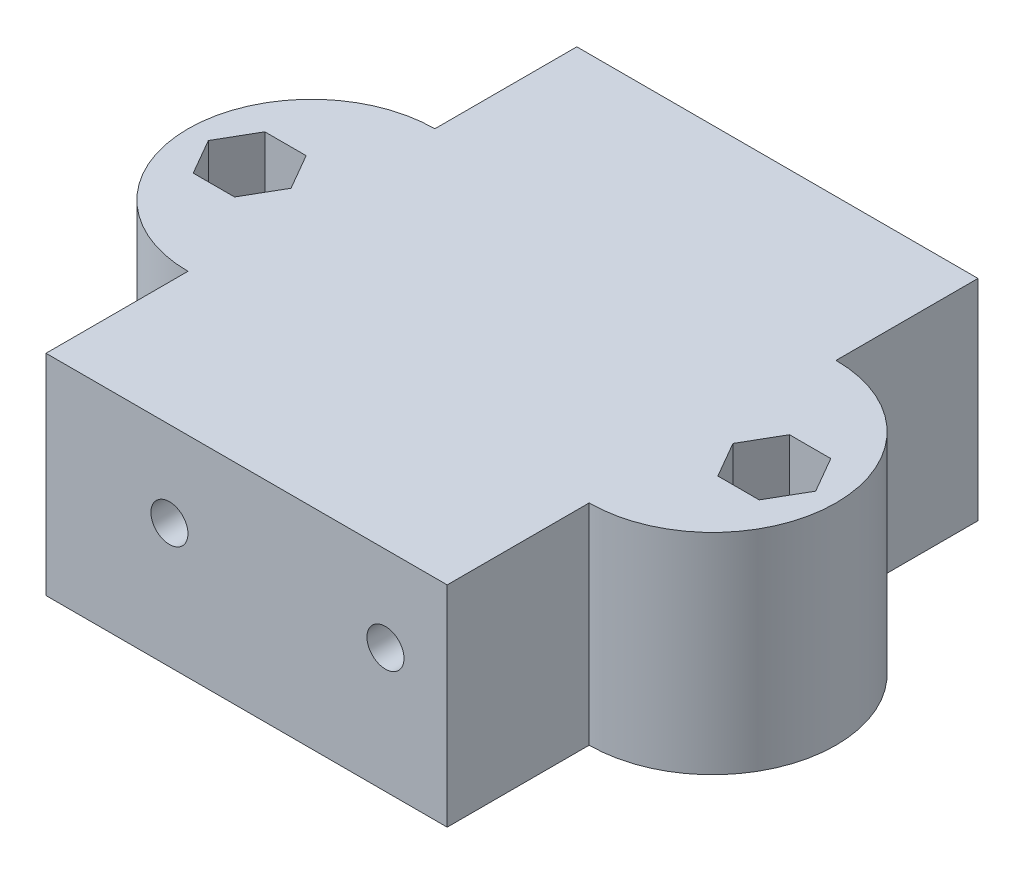
ISO-10303-21;
HEADER;
FILE_DESCRIPTION(('STEP AP214'),'2;1');
FILE_NAME('part.step','',(''),(''),'','','');
FILE_SCHEMA(('AUTOMOTIVE_DESIGN { 1 0 10303 214 1 1 1 1 }'));
ENDSEC;
DATA;
#1=APPLICATION_CONTEXT('core data for automotive mechanical design processes');
#2=APPLICATION_PROTOCOL_DEFINITION('international standard','automotive_design',2000,#1);
#3=PRODUCT_CONTEXT('',#1,'mechanical');
#4=PRODUCT('Part','Part','',(#3));
#5=PRODUCT_RELATED_PRODUCT_CATEGORY('part','',(#4));
#6=PRODUCT_DEFINITION_FORMATION('','',#4);
#7=PRODUCT_DEFINITION_CONTEXT('part definition',#1,'design');
#8=PRODUCT_DEFINITION('design','',#6,#7);
#9=PRODUCT_DEFINITION_SHAPE('','',#8);
#10=(LENGTH_UNIT() NAMED_UNIT(*) SI_UNIT(.MILLI.,.METRE.));
#11=(NAMED_UNIT(*) PLANE_ANGLE_UNIT() SI_UNIT($,.RADIAN.));
#12=(NAMED_UNIT(*) SI_UNIT($,.STERADIAN.) SOLID_ANGLE_UNIT());
#13=UNCERTAINTY_MEASURE_WITH_UNIT(LENGTH_MEASURE(1.E-05),#10,'distance_accuracy_value','');
#14=(GEOMETRIC_REPRESENTATION_CONTEXT(3) GLOBAL_UNCERTAINTY_ASSIGNED_CONTEXT((#13)) GLOBAL_UNIT_ASSIGNED_CONTEXT((#10,
#11,#12)) REPRESENTATION_CONTEXT('',''));
#15=CARTESIAN_POINT('',(0.,0.,0.));
#16=DIRECTION('',(0.,0.,1.));
#17=DIRECTION('',(1.,0.,0.));
#18=AXIS2_PLACEMENT_3D('',#15,#16,#17);
#19=CARTESIAN_POINT('',(21.25,0.,14.6466404826372));
#20=DIRECTION('',(0.,1.,0.));
#21=DIRECTION('',(0.,0.,1.));
#22=AXIS2_PLACEMENT_3D('',#19,#20,#21);
#23=CYLINDRICAL_SURFACE('',#22,1.75);
#24=CARTESIAN_POINT('',(21.25,0.,14.6466404826372));
#25=DIRECTION('',(0.,1.,0.));
#26=DIRECTION('',(0.,0.,1.));
#27=AXIS2_PLACEMENT_3D('',#24,#25,#26);
#28=CIRCLE('',#27,1.75);
#29=CARTESIAN_POINT('',(21.25,0.,16.3966404826372));
#30=VERTEX_POINT('',#29);
#31=EDGE_CURVE('E220',#30,#30,#28,.T.);
#32=ORIENTED_EDGE('',*,*,#31,.F.);
#33=EDGE_LOOP('',(#32));
#34=FACE_BOUND('',#33,.T.);
#35=CARTESIAN_POINT('',(21.25,7.,14.6466404826372));
#36=DIRECTION('',(0.,1.,0.));
#37=DIRECTION('',(0.,0.,1.));
#38=AXIS2_PLACEMENT_3D('',#35,#36,#37);
#39=CIRCLE('',#38,1.75);
#40=CARTESIAN_POINT('',(21.25,7.,16.3966404826372));
#41=VERTEX_POINT('',#40);
#42=EDGE_CURVE('E198',#41,#41,#39,.T.);
#43=ORIENTED_EDGE('',*,*,#42,.T.);
#44=EDGE_LOOP('',(#43));
#45=FACE_BOUND('',#44,.T.);
#46=ADVANCED_FACE('F34',(#34,#45),#23,.F.);
#47=CARTESIAN_POINT('',(0.,0.,0.));
#48=DIRECTION('',(0.,1.,0.));
#49=DIRECTION('',(0.,0.,1.));
#50=AXIS2_PLACEMENT_3D('',#47,#48,#49);
#51=PLANE('',#50);
#52=ORIENTED_EDGE('',*,*,#31,.T.);
#53=EDGE_LOOP('',(#52));
#54=FACE_BOUND('',#53,.T.);
#55=DIRECTION('',(0.,0.,-1.));
#56=VECTOR('',#55,1.);
#57=CARTESIAN_POINT('',(16.25,0.,-6.85335951736274));
#58=LINE('',#57,#56);
#59=CARTESIAN_POINT('',(16.25,0.,36.1466404826372));
#60=VERTEX_POINT('',#59);
#61=CARTESIAN_POINT('',(16.25,0.,24.6466404826372));
#62=VERTEX_POINT('',#61);
#63=EDGE_CURVE('E347',#60,#62,#58,.T.);
#64=ORIENTED_EDGE('',*,*,#63,.F.);
#65=DIRECTION('',(1.,0.,0.));
#66=VECTOR('',#65,1.);
#67=CARTESIAN_POINT('',(-16.25,0.,36.1466404826372));
#68=LINE('',#67,#66);
#69=CARTESIAN_POINT('',(-16.25,0.,36.1466404826372));
#70=VERTEX_POINT('',#69);
#71=EDGE_CURVE('E356',#70,#60,#68,.T.);
#72=ORIENTED_EDGE('',*,*,#71,.F.);
#73=DIRECTION('',(0.,0.,1.));
#74=VECTOR('',#73,1.);
#75=CARTESIAN_POINT('',(-16.25,0.,-6.85335951736274));
#76=LINE('',#75,#74);
#77=CARTESIAN_POINT('',(-16.25,0.,24.6466404826372));
#78=VERTEX_POINT('',#77);
#79=EDGE_CURVE('E352',#78,#70,#76,.T.);
#80=ORIENTED_EDGE('',*,*,#79,.F.);
#81=CARTESIAN_POINT('',(-16.25,0.,14.6466404826372));
#82=DIRECTION('',(0.,1.,0.));
#83=DIRECTION('',(0.,0.,1.));
#84=AXIS2_PLACEMENT_3D('',#81,#82,#83);
#85=CIRCLE('',#84,10.);
#86=CARTESIAN_POINT('',(-16.25,0.,4.64664048263725));
#87=VERTEX_POINT('',#86);
#88=EDGE_CURVE('E283',#78,#87,#85,.F.);
#89=ORIENTED_EDGE('',*,*,#88,.T.);
#90=CARTESIAN_POINT('',(-16.25,0.,-6.85335951736274));
#91=VERTEX_POINT('',#90);
#92=EDGE_CURVE('E353',#91,#87,#76,.T.);
#93=ORIENTED_EDGE('',*,*,#92,.F.);
#94=DIRECTION('',(-1.,0.,0.));
#95=VECTOR('',#94,1.);
#96=CARTESIAN_POINT('',(-16.25,0.,-6.85335951736274));
#97=LINE('',#96,#95);
#98=CARTESIAN_POINT('',(16.25,0.,-6.85335951736274));
#99=VERTEX_POINT('',#98);
#100=EDGE_CURVE('E350',#99,#91,#97,.T.);
#101=ORIENTED_EDGE('',*,*,#100,.F.);
#102=CARTESIAN_POINT('',(16.25,0.,4.64664048263725));
#103=VERTEX_POINT('',#102);
#104=EDGE_CURVE('E346',#103,#99,#58,.T.);
#105=ORIENTED_EDGE('',*,*,#104,.F.);
#106=CARTESIAN_POINT('',(16.25,0.,14.6466404826372));
#107=DIRECTION('',(0.,1.,0.));
#108=DIRECTION('',(0.,0.,1.));
#109=AXIS2_PLACEMENT_3D('',#106,#107,#108);
#110=CIRCLE('',#109,10.);
#111=EDGE_CURVE('E293',#103,#62,#110,.F.);
#112=ORIENTED_EDGE('',*,*,#111,.T.);
#113=EDGE_LOOP('',(#64,#72,#80,#89,#93,#101,#105,#112));
#114=FACE_BOUND('',#113,.T.);
#115=CARTESIAN_POINT('',(0.,0.,14.6466404826372));
#116=DIRECTION('',(0.,1.,0.));
#117=DIRECTION('',(0.,0.,1.));
#118=AXIS2_PLACEMENT_3D('',#115,#116,#117);
#119=CIRCLE('',#118,11.9);
#120=CARTESIAN_POINT('',(0.,0.,26.5466404826372));
#121=VERTEX_POINT('',#120);
#122=EDGE_CURVE('E343',#121,#121,#119,.T.);
#123=ORIENTED_EDGE('',*,*,#122,.T.);
#124=EDGE_LOOP('',(#123));
#125=FACE_BOUND('',#124,.T.);
#126=CARTESIAN_POINT('',(-21.25,0.,14.6466404826373));
#127=DIRECTION('',(0.,1.,0.));
#128=DIRECTION('',(0.,0.,1.));
#129=AXIS2_PLACEMENT_3D('',#126,#127,#128);
#130=CIRCLE('',#129,1.75);
#131=CARTESIAN_POINT('',(-21.25,0.,16.3966404826372));
#132=VERTEX_POINT('',#131);
#133=EDGE_CURVE('E277',#132,#132,#130,.F.);
#134=ORIENTED_EDGE('',*,*,#133,.F.);
#135=EDGE_LOOP('',(#134));
#136=FACE_BOUND('',#135,.T.);
#137=ADVANCED_FACE('F373',(#54,#114,#125,#136),#51,.F.);
#138=CARTESIAN_POINT('',(0.,17.,0.));
#139=DIRECTION('',(0.,1.,0.));
#140=DIRECTION('',(0.,0.,1.));
#141=AXIS2_PLACEMENT_3D('',#138,#139,#140);
#142=PLANE('',#141);
#143=DIRECTION('',(1.,0.,0.));
#144=VECTOR('',#143,1.);
#145=CARTESIAN_POINT('',(19.5756842193501,17.,17.5466404826372));
#146=LINE('',#145,#144);
#147=CARTESIAN_POINT('',(19.5756842193501,17.,17.5466404826372));
#148=VERTEX_POINT('',#147);
#149=CARTESIAN_POINT('',(22.9243157806499,17.,17.5466404826372));
#150=VERTEX_POINT('',#149);
#151=EDGE_CURVE('E49',#148,#150,#146,.T.);
#152=ORIENTED_EDGE('',*,*,#151,.F.);
#153=DIRECTION('',(0.5,0.,0.866025403784439));
#154=VECTOR('',#153,1.);
#155=CARTESIAN_POINT('',(17.9013684387002,17.,14.6466404826372));
#156=LINE('',#155,#154);
#157=CARTESIAN_POINT('',(17.9013684387002,17.,14.6466404826372));
#158=VERTEX_POINT('',#157);
#159=EDGE_CURVE('E192',#158,#148,#156,.T.);
#160=ORIENTED_EDGE('',*,*,#159,.F.);
#161=DIRECTION('',(-0.499999999999999,0.,0.866025403784439));
#162=VECTOR('',#161,1.);
#163=CARTESIAN_POINT('',(19.5756842193501,17.,11.7466404826372));
#164=LINE('',#163,#162);
#165=CARTESIAN_POINT('',(19.5756842193501,17.,11.7466404826372));
#166=VERTEX_POINT('',#165);
#167=EDGE_CURVE('E195',#166,#158,#164,.T.);
#168=ORIENTED_EDGE('',*,*,#167,.F.);
#169=DIRECTION('',(-1.,0.,0.));
#170=VECTOR('',#169,1.);
#171=CARTESIAN_POINT('',(22.9243157806499,17.,11.7466404826372));
#172=LINE('',#171,#170);
#173=CARTESIAN_POINT('',(22.9243157806499,17.,11.7466404826372));
#174=VERTEX_POINT('',#173);
#175=EDGE_CURVE('E213',#174,#166,#172,.T.);
#176=ORIENTED_EDGE('',*,*,#175,.F.);
#177=DIRECTION('',(-0.500000000000001,0.,-0.866025403784438));
#178=VECTOR('',#177,1.);
#179=CARTESIAN_POINT('',(24.5986315612998,17.,14.6466404826372));
#180=LINE('',#179,#178);
#181=CARTESIAN_POINT('',(24.5986315612998,17.,14.6466404826372));
#182=VERTEX_POINT('',#181);
#183=EDGE_CURVE('E210',#182,#174,#180,.T.);
#184=ORIENTED_EDGE('',*,*,#183,.F.);
#185=DIRECTION('',(0.5,0.,-0.866025403784438));
#186=VECTOR('',#185,1.);
#187=CARTESIAN_POINT('',(22.9243157806499,17.,17.5466404826372));
#188=LINE('',#187,#186);
#189=EDGE_CURVE('E208',#150,#182,#188,.T.);
#190=ORIENTED_EDGE('',*,*,#189,.F.);
#191=EDGE_LOOP('',(#152,#160,#168,#176,#184,#190));
#192=FACE_BOUND('',#191,.T.);
#193=DIRECTION('',(0.5,0.,-0.866025403784439));
#194=VECTOR('',#193,1.);
#195=CARTESIAN_POINT('',(-17.9013684387002,17.,14.6466404826373));
#196=LINE('',#195,#194);
#197=CARTESIAN_POINT('',(-19.5756842193501,17.,17.5466404826372));
#198=VERTEX_POINT('',#197);
#199=CARTESIAN_POINT('',(-17.9013684387002,17.,14.6466404826373));
#200=VERTEX_POINT('',#199);
#201=EDGE_CURVE('E57',#198,#200,#196,.T.);
#202=ORIENTED_EDGE('',*,*,#201,.F.);
#203=DIRECTION('',(1.,0.,0.));
#204=VECTOR('',#203,1.);
#205=CARTESIAN_POINT('',(-19.5756842193501,17.,17.5466404826372));
#206=LINE('',#205,#204);
#207=CARTESIAN_POINT('',(-22.9243157806499,17.,17.5466404826373));
#208=VERTEX_POINT('',#207);
#209=EDGE_CURVE('E235',#208,#198,#206,.T.);
#210=ORIENTED_EDGE('',*,*,#209,.F.);
#211=DIRECTION('',(0.5,0.,0.866025403784439));
#212=VECTOR('',#211,1.);
#213=CARTESIAN_POINT('',(-22.9243157806499,17.,17.5466404826373));
#214=LINE('',#213,#212);
#215=CARTESIAN_POINT('',(-24.5986315612998,17.,14.6466404826373));
#216=VERTEX_POINT('',#215);
#217=EDGE_CURVE('E261',#216,#208,#214,.T.);
#218=ORIENTED_EDGE('',*,*,#217,.F.);
#219=DIRECTION('',(-0.500000000000001,0.,0.866025403784438));
#220=VECTOR('',#219,1.);
#221=CARTESIAN_POINT('',(-24.5986315612998,17.,14.6466404826373));
#222=LINE('',#221,#220);
#223=CARTESIAN_POINT('',(-22.9243157806499,17.,11.7466404826373));
#224=VERTEX_POINT('',#223);
#225=EDGE_CURVE('E258',#224,#216,#222,.T.);
#226=ORIENTED_EDGE('',*,*,#225,.F.);
#227=DIRECTION('',(-1.,0.,0.));
#228=VECTOR('',#227,1.);
#229=CARTESIAN_POINT('',(-22.9243157806499,17.,11.7466404826373));
#230=LINE('',#229,#228);
#231=CARTESIAN_POINT('',(-19.5756842193501,17.,11.7466404826373));
#232=VERTEX_POINT('',#231);
#233=EDGE_CURVE('E255',#232,#224,#230,.T.);
#234=ORIENTED_EDGE('',*,*,#233,.F.);
#235=DIRECTION('',(-0.499999999999999,0.,-0.866025403784439));
#236=VECTOR('',#235,1.);
#237=CARTESIAN_POINT('',(-19.5756842193501,17.,11.7466404826373));
#238=LINE('',#237,#236);
#239=EDGE_CURVE('E252',#200,#232,#238,.T.);
#240=ORIENTED_EDGE('',*,*,#239,.F.);
#241=EDGE_LOOP('',(#202,#210,#218,#226,#234,#240));
#242=FACE_BOUND('',#241,.T.);
#243=DIRECTION('',(0.,0.,-1.));
#244=VECTOR('',#243,1.);
#245=CARTESIAN_POINT('',(16.25,17.,-6.85335951736274));
#246=LINE('',#245,#244);
#247=CARTESIAN_POINT('',(16.25,17.,36.1466404826372));
#248=VERTEX_POINT('',#247);
#249=CARTESIAN_POINT('',(16.25,17.,24.6466404826372));
#250=VERTEX_POINT('',#249);
#251=EDGE_CURVE('E327',#248,#250,#246,.T.);
#252=ORIENTED_EDGE('',*,*,#251,.T.);
#253=CARTESIAN_POINT('',(16.25,17.,14.6466404826372));
#254=DIRECTION('',(0.,1.,0.));
#255=DIRECTION('',(0.,0.,-1.));
#256=AXIS2_PLACEMENT_3D('',#253,#254,#255);
#257=CIRCLE('',#256,10.);
#258=CARTESIAN_POINT('',(16.25,17.,4.64664048263725));
#259=VERTEX_POINT('',#258);
#260=EDGE_CURVE('E285',#250,#259,#257,.T.);
#261=ORIENTED_EDGE('',*,*,#260,.T.);
#262=CARTESIAN_POINT('',(16.25,17.,-6.85335951736274));
#263=VERTEX_POINT('',#262);
#264=EDGE_CURVE('E318',#259,#263,#246,.T.);
#265=ORIENTED_EDGE('',*,*,#264,.T.);
#266=DIRECTION('',(-1.,0.,0.));
#267=VECTOR('',#266,1.);
#268=CARTESIAN_POINT('',(-16.25,17.,-6.85335951736274));
#269=LINE('',#268,#267);
#270=CARTESIAN_POINT('',(-16.25,17.,-6.85335951736274));
#271=VERTEX_POINT('',#270);
#272=EDGE_CURVE('E330',#263,#271,#269,.T.);
#273=ORIENTED_EDGE('',*,*,#272,.T.);
#274=DIRECTION('',(0.,0.,1.));
#275=VECTOR('',#274,1.);
#276=CARTESIAN_POINT('',(-16.25,17.,-6.85335951736274));
#277=LINE('',#276,#275);
#278=CARTESIAN_POINT('',(-16.25,17.,4.64664048263725));
#279=VERTEX_POINT('',#278);
#280=EDGE_CURVE('E334',#271,#279,#277,.T.);
#281=ORIENTED_EDGE('',*,*,#280,.T.);
#282=CARTESIAN_POINT('',(-16.25,17.,14.6466404826372));
#283=DIRECTION('',(0.,1.,0.));
#284=DIRECTION('',(0.,0.,1.));
#285=AXIS2_PLACEMENT_3D('',#282,#283,#284);
#286=CIRCLE('',#285,10.);
#287=CARTESIAN_POINT('',(-16.25,17.,24.6466404826372));
#288=VERTEX_POINT('',#287);
#289=EDGE_CURVE('E280',#279,#288,#286,.T.);
#290=ORIENTED_EDGE('',*,*,#289,.T.);
#291=CARTESIAN_POINT('',(-16.25,17.,36.1466404826372));
#292=VERTEX_POINT('',#291);
#293=EDGE_CURVE('E333',#288,#292,#277,.T.);
#294=ORIENTED_EDGE('',*,*,#293,.T.);
#295=DIRECTION('',(1.,0.,0.));
#296=VECTOR('',#295,1.);
#297=CARTESIAN_POINT('',(-16.25,17.,36.1466404826372));
#298=LINE('',#297,#296);
#299=EDGE_CURVE('E337',#292,#248,#298,.T.);
#300=ORIENTED_EDGE('',*,*,#299,.T.);
#301=EDGE_LOOP('',(#252,#261,#265,#273,#281,#290,#294,#300));
#302=FACE_BOUND('',#301,.T.);
#303=ADVANCED_FACE('F383',(#192,#242,#302),#142,.T.);
#304=CARTESIAN_POINT('',(-16.25,12.,-6.85335951736274));
#305=DIRECTION('',(1.,0.,0.));
#306=DIRECTION('',(0.,0.,-1.));
#307=AXIS2_PLACEMENT_3D('',#304,#305,#306);
#308=PLANE('',#307);
#309=ORIENTED_EDGE('',*,*,#92,.T.);
#310=DIRECTION('',(0.,1.,0.));
#311=VECTOR('',#310,1.);
#312=CARTESIAN_POINT('',(-16.25,-22.3606797749979,4.64664048263725));
#313=LINE('',#312,#311);
#314=EDGE_CURVE('E286',#87,#279,#313,.T.);
#315=ORIENTED_EDGE('',*,*,#314,.T.);
#316=ORIENTED_EDGE('',*,*,#280,.F.);
#317=DIRECTION('',(0.,-1.,0.));
#318=VECTOR('',#317,1.);
#319=CARTESIAN_POINT('',(-16.25,12.,-6.85335951736274));
#320=LINE('',#319,#318);
#321=EDGE_CURVE('E42',#271,#91,#320,.T.);
#322=ORIENTED_EDGE('',*,*,#321,.T.);
#323=EDGE_LOOP('',(#309,#315,#316,#322));
#324=FACE_BOUND('',#323,.T.);
#325=ADVANCED_FACE('F367',(#324),#308,.F.);
#326=CARTESIAN_POINT('',(16.25,12.,-6.85335951736274));
#327=DIRECTION('',(-1.,0.,0.));
#328=DIRECTION('',(0.,0.,1.));
#329=AXIS2_PLACEMENT_3D('',#326,#327,#328);
#330=PLANE('',#329);
#331=ORIENTED_EDGE('',*,*,#63,.T.);
#332=DIRECTION('',(0.,1.,0.));
#333=VECTOR('',#332,1.);
#334=CARTESIAN_POINT('',(16.25,-22.3606797749979,24.6466404826372));
#335=LINE('',#334,#333);
#336=EDGE_CURVE('E296',#62,#250,#335,.T.);
#337=ORIENTED_EDGE('',*,*,#336,.T.);
#338=ORIENTED_EDGE('',*,*,#251,.F.);
#339=DIRECTION('',(0.,-1.,0.));
#340=VECTOR('',#339,1.);
#341=CARTESIAN_POINT('',(16.25,12.,36.1466404826372));
#342=LINE('',#341,#340);
#343=EDGE_CURVE('E358',#248,#60,#342,.T.);
#344=ORIENTED_EDGE('',*,*,#343,.T.);
#345=EDGE_LOOP('',(#331,#337,#338,#344));
#346=FACE_BOUND('',#345,.T.);
#347=ADVANCED_FACE('F394',(#346),#330,.F.);
#348=ORIENTED_EDGE('',*,*,#264,.F.);
#349=DIRECTION('',(0.,1.,0.));
#350=VECTOR('',#349,1.);
#351=CARTESIAN_POINT('',(16.25,-22.3606797749979,4.64664048263725));
#352=LINE('',#351,#350);
#353=EDGE_CURVE('E298',#103,#259,#352,.T.);
#354=ORIENTED_EDGE('',*,*,#353,.F.);
#355=ORIENTED_EDGE('',*,*,#104,.T.);
#356=DIRECTION('',(0.,-1.,0.));
#357=VECTOR('',#356,1.);
#358=CARTESIAN_POINT('',(16.25,12.,-6.85335951736274));
#359=LINE('',#358,#357);
#360=EDGE_CURVE('E11',#263,#99,#359,.T.);
#361=ORIENTED_EDGE('',*,*,#360,.F.);
#362=EDGE_LOOP('',(#348,#354,#355,#361));
#363=FACE_BOUND('',#362,.T.);
#364=ADVANCED_FACE('F36',(#363),#330,.F.);
#365=CARTESIAN_POINT('',(-16.25,12.,-6.85335951736274));
#366=DIRECTION('',(0.,0.,1.));
#367=DIRECTION('',(1.,0.,0.));
#368=AXIS2_PLACEMENT_3D('',#365,#366,#367);
#369=PLANE('',#368);
#370=CARTESIAN_POINT('',(11.2500000000001,10.0868549164128,-6.85335951736274));
#371=DIRECTION('',(0.,0.,1.));
#372=DIRECTION('',(1.,0.,0.));
#373=AXIS2_PLACEMENT_3D('',#370,#371,#372);
#374=CIRCLE('',#373,1.5);
#375=CARTESIAN_POINT('',(12.7500000000001,10.0868549164128,-6.85335951736274));
#376=VERTEX_POINT('',#375);
#377=EDGE_CURVE('E307',#376,#376,#374,.T.);
#378=ORIENTED_EDGE('',*,*,#377,.T.);
#379=EDGE_LOOP('',(#378));
#380=FACE_BOUND('',#379,.T.);
#381=CARTESIAN_POINT('',(-6.24999999999995,10.0868549164128,-6.85335951736274));
#382=DIRECTION('',(0.,0.,1.));
#383=DIRECTION('',(1.,0.,0.));
#384=AXIS2_PLACEMENT_3D('',#381,#382,#383);
#385=CIRCLE('',#384,1.5);
#386=CARTESIAN_POINT('',(-4.74999999999995,10.0868549164128,-6.85335951736274));
#387=VERTEX_POINT('',#386);
#388=EDGE_CURVE('E295',#387,#387,#385,.T.);
#389=ORIENTED_EDGE('',*,*,#388,.T.);
#390=EDGE_LOOP('',(#389));
#391=FACE_BOUND('',#390,.T.);
#392=ORIENTED_EDGE('',*,*,#100,.T.);
#393=ORIENTED_EDGE('',*,*,#321,.F.);
#394=ORIENTED_EDGE('',*,*,#272,.F.);
#395=ORIENTED_EDGE('',*,*,#360,.T.);
#396=EDGE_LOOP('',(#392,#393,#394,#395));
#397=FACE_BOUND('',#396,.T.);
#398=ADVANCED_FACE('F386',(#380,#391,#397),#369,.F.);
#399=ORIENTED_EDGE('',*,*,#293,.F.);
#400=DIRECTION('',(0.,1.,0.));
#401=VECTOR('',#400,1.);
#402=CARTESIAN_POINT('',(-16.25,-22.3606797749979,24.6466404826372));
#403=LINE('',#402,#401);
#404=EDGE_CURVE('E288',#78,#288,#403,.T.);
#405=ORIENTED_EDGE('',*,*,#404,.F.);
#406=ORIENTED_EDGE('',*,*,#79,.T.);
#407=DIRECTION('',(0.,-1.,0.));
#408=VECTOR('',#407,1.);
#409=CARTESIAN_POINT('',(-16.25,12.,36.1466404826372));
#410=LINE('',#409,#408);
#411=EDGE_CURVE('E361',#292,#70,#410,.T.);
#412=ORIENTED_EDGE('',*,*,#411,.F.);
#413=EDGE_LOOP('',(#399,#405,#406,#412));
#414=FACE_BOUND('',#413,.T.);
#415=ADVANCED_FACE('F401',(#414),#308,.F.);
#416=CARTESIAN_POINT('',(-16.25,12.,36.1466404826372));
#417=DIRECTION('',(0.,0.,-1.));
#418=DIRECTION('',(-1.,0.,0.));
#419=AXIS2_PLACEMENT_3D('',#416,#417,#418);
#420=PLANE('',#419);
#421=CARTESIAN_POINT('',(11.2500000000001,10.0868549164128,36.1466404826372));
#422=DIRECTION('',(0.,0.,1.));
#423=DIRECTION('',(1.,0.,0.));
#424=AXIS2_PLACEMENT_3D('',#421,#422,#423);
#425=CIRCLE('',#424,1.5);
#426=CARTESIAN_POINT('',(12.7500000000001,10.0868549164128,36.1466404826372));
#427=VERTEX_POINT('',#426);
#428=EDGE_CURVE('E319',#427,#427,#425,.T.);
#429=ORIENTED_EDGE('',*,*,#428,.F.);
#430=EDGE_LOOP('',(#429));
#431=FACE_BOUND('',#430,.T.);
#432=CARTESIAN_POINT('',(-6.24999999999995,10.0868549164128,36.1466404826372));
#433=DIRECTION('',(0.,0.,1.));
#434=DIRECTION('',(1.,0.,0.));
#435=AXIS2_PLACEMENT_3D('',#432,#433,#434);
#436=CIRCLE('',#435,1.5);
#437=CARTESIAN_POINT('',(-4.74999999999995,10.0868549164128,36.1466404826372));
#438=VERTEX_POINT('',#437);
#439=EDGE_CURVE('E306',#438,#438,#436,.T.);
#440=ORIENTED_EDGE('',*,*,#439,.F.);
#441=EDGE_LOOP('',(#440));
#442=FACE_BOUND('',#441,.T.);
#443=ORIENTED_EDGE('',*,*,#71,.T.);
#444=ORIENTED_EDGE('',*,*,#343,.F.);
#445=ORIENTED_EDGE('',*,*,#299,.F.);
#446=ORIENTED_EDGE('',*,*,#411,.T.);
#447=EDGE_LOOP('',(#443,#444,#445,#446));
#448=FACE_BOUND('',#447,.T.);
#449=ADVANCED_FACE('F397',(#431,#442,#448),#420,.F.);
#450=CARTESIAN_POINT('',(0.,12.,14.6466404826372));
#451=DIRECTION('',(0.,-1.,0.));
#452=DIRECTION('',(0.,0.,-1.));
#453=AXIS2_PLACEMENT_3D('',#450,#451,#452);
#454=CYLINDRICAL_SURFACE('',#453,11.9);
#455=CARTESIAN_POINT('',(0.,12.,14.6466404826372));
#456=DIRECTION('',(0.,1.,0.));
#457=DIRECTION('',(0.,0.,1.));
#458=AXIS2_PLACEMENT_3D('',#455,#456,#457);
#459=CIRCLE('',#458,11.9);
#460=CARTESIAN_POINT('',(0.,12.,26.5466404826372));
#461=VERTEX_POINT('',#460);
#462=EDGE_CURVE('E340',#461,#461,#459,.T.);
#463=ORIENTED_EDGE('',*,*,#462,.T.);
#464=EDGE_LOOP('',(#463));
#465=FACE_BOUND('',#464,.T.);
#466=ORIENTED_EDGE('',*,*,#122,.F.);
#467=EDGE_LOOP('',(#466));
#468=FACE_BOUND('',#467,.T.);
#469=ADVANCED_FACE('F408',(#465,#468),#454,.F.);
#470=CARTESIAN_POINT('',(0.,12.,0.));
#471=DIRECTION('',(0.,1.,0.));
#472=DIRECTION('',(0.,0.,1.));
#473=AXIS2_PLACEMENT_3D('',#470,#471,#472);
#474=PLANE('',#473);
#475=ORIENTED_EDGE('',*,*,#462,.F.);
#476=EDGE_LOOP('',(#475));
#477=FACE_BOUND('',#476,.T.);
#478=ADVANCED_FACE('F462',(#477),#474,.F.);
#479=CARTESIAN_POINT('',(-6.24999999999995,10.0868549164128,26.1466404826372));
#480=DIRECTION('',(0.,0.,1.));
#481=DIRECTION('',(1.,0.,0.));
#482=AXIS2_PLACEMENT_3D('',#479,#480,#481);
#483=CYLINDRICAL_SURFACE('',#482,1.5);
#484=CARTESIAN_POINT('',(-6.24999999999995,10.0868549164128,26.1466404826372));
#485=DIRECTION('',(0.,0.,1.));
#486=DIRECTION('',(1.,0.,0.));
#487=AXIS2_PLACEMENT_3D('',#484,#485,#486);
#488=CIRCLE('',#487,1.5);
#489=CARTESIAN_POINT('',(-4.74999999999995,10.0868549164128,26.1466404826372));
#490=VERTEX_POINT('',#489);
#491=EDGE_CURVE('E322',#490,#490,#488,.T.);
#492=ORIENTED_EDGE('',*,*,#491,.F.);
#493=EDGE_LOOP('',(#492));
#494=FACE_BOUND('',#493,.T.);
#495=ORIENTED_EDGE('',*,*,#439,.T.);
#496=EDGE_LOOP('',(#495));
#497=FACE_BOUND('',#496,.T.);
#498=ADVANCED_FACE('F458',(#494,#497),#483,.F.);
#499=CARTESIAN_POINT('',(-6.24999999999995,10.0868549164128,26.1466404826372));
#500=DIRECTION('',(0.,0.,1.));
#501=DIRECTION('',(1.,0.,0.));
#502=AXIS2_PLACEMENT_3D('',#499,#500,#501);
#503=PLANE('',#502);
#504=ORIENTED_EDGE('',*,*,#491,.T.);
#505=EDGE_LOOP('',(#504));
#506=FACE_BOUND('',#505,.T.);
#507=ADVANCED_FACE('F454',(#506),#503,.T.);
#508=CARTESIAN_POINT('',(11.2500000000001,10.0868549164128,26.1466404826372));
#509=DIRECTION('',(0.,0.,1.));
#510=DIRECTION('',(1.,0.,0.));
#511=AXIS2_PLACEMENT_3D('',#508,#509,#510);
#512=CYLINDRICAL_SURFACE('',#511,1.5);
#513=CARTESIAN_POINT('',(11.2500000000001,10.0868549164128,26.1466404826372));
#514=DIRECTION('',(0.,0.,1.));
#515=DIRECTION('',(1.,0.,0.));
#516=AXIS2_PLACEMENT_3D('',#513,#514,#515);
#517=CIRCLE('',#516,1.5);
#518=CARTESIAN_POINT('',(12.7500000000001,10.0868549164128,26.1466404826372));
#519=VERTEX_POINT('',#518);
#520=EDGE_CURVE('E315',#519,#519,#517,.T.);
#521=ORIENTED_EDGE('',*,*,#520,.F.);
#522=EDGE_LOOP('',(#521));
#523=FACE_BOUND('',#522,.T.);
#524=ORIENTED_EDGE('',*,*,#428,.T.);
#525=EDGE_LOOP('',(#524));
#526=FACE_BOUND('',#525,.T.);
#527=ADVANCED_FACE('F450',(#523,#526),#512,.F.);
#528=CARTESIAN_POINT('',(11.2500000000001,10.0868549164128,26.1466404826372));
#529=DIRECTION('',(0.,0.,1.));
#530=DIRECTION('',(1.,0.,0.));
#531=AXIS2_PLACEMENT_3D('',#528,#529,#530);
#532=PLANE('',#531);
#533=ORIENTED_EDGE('',*,*,#520,.T.);
#534=EDGE_LOOP('',(#533));
#535=FACE_BOUND('',#534,.T.);
#536=ADVANCED_FACE('F446',(#535),#532,.T.);
#537=CARTESIAN_POINT('',(-6.24999999999995,10.0868549164128,3.14664048263726));
#538=DIRECTION('',(0.,0.,-1.));
#539=DIRECTION('',(-1.,0.,0.));
#540=AXIS2_PLACEMENT_3D('',#537,#538,#539);
#541=CYLINDRICAL_SURFACE('',#540,1.5);
#542=CARTESIAN_POINT('',(-6.24999999999995,10.0868549164128,3.14664048263726));
#543=DIRECTION('',(0.,0.,1.));
#544=DIRECTION('',(1.,0.,0.));
#545=AXIS2_PLACEMENT_3D('',#542,#543,#544);
#546=CIRCLE('',#545,1.5);
#547=CARTESIAN_POINT('',(-4.74999999999995,10.0868549164128,3.14664048263726));
#548=VERTEX_POINT('',#547);
#549=EDGE_CURVE('E310',#548,#548,#546,.T.);
#550=ORIENTED_EDGE('',*,*,#549,.T.);
#551=EDGE_LOOP('',(#550));
#552=FACE_BOUND('',#551,.T.);
#553=ORIENTED_EDGE('',*,*,#388,.F.);
#554=EDGE_LOOP('',(#553));
#555=FACE_BOUND('',#554,.T.);
#556=ADVANCED_FACE('F442',(#552,#555),#541,.F.);
#557=CARTESIAN_POINT('',(-6.24999999999995,10.0868549164128,3.14664048263726));
#558=DIRECTION('',(0.,0.,-1.));
#559=DIRECTION('',(1.,0.,0.));
#560=AXIS2_PLACEMENT_3D('',#557,#558,#559);
#561=PLANE('',#560);
#562=ORIENTED_EDGE('',*,*,#549,.F.);
#563=EDGE_LOOP('',(#562));
#564=FACE_BOUND('',#563,.T.);
#565=ADVANCED_FACE('F438',(#564),#561,.T.);
#566=CARTESIAN_POINT('',(11.2500000000001,10.0868549164128,3.14664048263726));
#567=DIRECTION('',(0.,0.,-1.));
#568=DIRECTION('',(-1.,0.,0.));
#569=AXIS2_PLACEMENT_3D('',#566,#567,#568);
#570=CYLINDRICAL_SURFACE('',#569,1.5);
#571=CARTESIAN_POINT('',(11.2500000000001,10.0868549164128,3.14664048263726));
#572=DIRECTION('',(0.,0.,1.));
#573=DIRECTION('',(1.,0.,0.));
#574=AXIS2_PLACEMENT_3D('',#571,#572,#573);
#575=CIRCLE('',#574,1.5);
#576=CARTESIAN_POINT('',(12.7500000000001,10.0868549164128,3.14664048263726));
#577=VERTEX_POINT('',#576);
#578=EDGE_CURVE('E303',#577,#577,#575,.T.);
#579=ORIENTED_EDGE('',*,*,#578,.T.);
#580=EDGE_LOOP('',(#579));
#581=FACE_BOUND('',#580,.T.);
#582=ORIENTED_EDGE('',*,*,#377,.F.);
#583=EDGE_LOOP('',(#582));
#584=FACE_BOUND('',#583,.T.);
#585=ADVANCED_FACE('F434',(#581,#584),#570,.F.);
#586=CARTESIAN_POINT('',(11.2500000000001,10.0868549164128,3.14664048263726));
#587=DIRECTION('',(0.,0.,-1.));
#588=DIRECTION('',(1.,0.,0.));
#589=AXIS2_PLACEMENT_3D('',#586,#587,#588);
#590=PLANE('',#589);
#591=ORIENTED_EDGE('',*,*,#578,.F.);
#592=EDGE_LOOP('',(#591));
#593=FACE_BOUND('',#592,.T.);
#594=ADVANCED_FACE('F431',(#593),#590,.T.);
#595=CARTESIAN_POINT('',(16.25,-22.3606797749979,14.6466404826372));
#596=DIRECTION('',(0.,1.,0.));
#597=DIRECTION('',(0.,0.,1.));
#598=AXIS2_PLACEMENT_3D('',#595,#596,#597);
#599=CYLINDRICAL_SURFACE('',#598,10.);
#600=ORIENTED_EDGE('',*,*,#111,.F.);
#601=ORIENTED_EDGE('',*,*,#353,.T.);
#602=ORIENTED_EDGE('',*,*,#260,.F.);
#603=ORIENTED_EDGE('',*,*,#336,.F.);
#604=EDGE_LOOP('',(#600,#601,#602,#603));
#605=FACE_BOUND('',#604,.T.);
#606=ADVANCED_FACE('F391',(#605),#599,.T.);
#607=CARTESIAN_POINT('',(-16.25,-22.3606797749979,14.6466404826372));
#608=DIRECTION('',(0.,1.,0.));
#609=DIRECTION('',(0.,0.,1.));
#610=AXIS2_PLACEMENT_3D('',#607,#608,#609);
#611=CYLINDRICAL_SURFACE('',#610,10.);
#612=ORIENTED_EDGE('',*,*,#88,.F.);
#613=ORIENTED_EDGE('',*,*,#404,.T.);
#614=ORIENTED_EDGE('',*,*,#289,.F.);
#615=ORIENTED_EDGE('',*,*,#314,.F.);
#616=EDGE_LOOP('',(#612,#613,#614,#615));
#617=FACE_BOUND('',#616,.T.);
#618=ADVANCED_FACE('F381',(#617),#611,.T.);
#619=CARTESIAN_POINT('',(-21.25,0.,14.6466404826373));
#620=DIRECTION('',(0.,1.,0.));
#621=DIRECTION('',(0.,0.,1.));
#622=AXIS2_PLACEMENT_3D('',#619,#620,#621);
#623=CYLINDRICAL_SURFACE('',#622,1.75);
#624=CARTESIAN_POINT('',(-21.25,7.,14.6466404826373));
#625=DIRECTION('',(0.,1.,0.));
#626=DIRECTION('',(0.,0.,-1.));
#627=AXIS2_PLACEMENT_3D('',#624,#625,#626);
#628=CIRCLE('',#627,1.75);
#629=CARTESIAN_POINT('',(-21.25,7.,12.8966404826373));
#630=VERTEX_POINT('',#629);
#631=EDGE_CURVE('E228',#630,#630,#628,.T.);
#632=ORIENTED_EDGE('',*,*,#631,.T.);
#633=EDGE_LOOP('',(#632));
#634=FACE_BOUND('',#633,.T.);
#635=ORIENTED_EDGE('',*,*,#133,.T.);
#636=EDGE_LOOP('',(#635));
#637=FACE_BOUND('',#636,.T.);
#638=ADVANCED_FACE('F425',(#634,#637),#623,.F.);
#639=CARTESIAN_POINT('',(-17.9013684387002,7.,14.6466404826373));
#640=DIRECTION('',(0.866025403784439,0.,0.5));
#641=DIRECTION('',(0.5,0.,-0.866025403784439));
#642=AXIS2_PLACEMENT_3D('',#639,#640,#641);
#643=PLANE('',#642);
#644=ORIENTED_EDGE('',*,*,#201,.T.);
#645=DIRECTION('',(0.,1.,0.));
#646=VECTOR('',#645,1.);
#647=CARTESIAN_POINT('',(-17.9013684387002,7.,14.6466404826373));
#648=LINE('',#647,#646);
#649=CARTESIAN_POINT('',(-17.9013684387002,7.,14.6466404826373));
#650=VERTEX_POINT('',#649);
#651=EDGE_CURVE('E250',#650,#200,#648,.T.);
#652=ORIENTED_EDGE('',*,*,#651,.F.);
#653=DIRECTION('',(0.5,0.,-0.866025403784439));
#654=VECTOR('',#653,1.);
#655=CARTESIAN_POINT('',(-17.9013684387002,7.,14.6466404826373));
#656=LINE('',#655,#654);
#657=CARTESIAN_POINT('',(-19.5756842193501,7.,17.5466404826372));
#658=VERTEX_POINT('',#657);
#659=EDGE_CURVE('E231',#658,#650,#656,.T.);
#660=ORIENTED_EDGE('',*,*,#659,.F.);
#661=DIRECTION('',(0.,1.,0.));
#662=VECTOR('',#661,1.);
#663=CARTESIAN_POINT('',(-19.5756842193501,7.,17.5466404826372));
#664=LINE('',#663,#662);
#665=EDGE_CURVE('E266',#658,#198,#664,.T.);
#666=ORIENTED_EDGE('',*,*,#665,.T.);
#667=EDGE_LOOP('',(#644,#652,#660,#666));
#668=FACE_BOUND('',#667,.T.);
#669=ADVANCED_FACE('F481',(#668),#643,.F.);
#670=CARTESIAN_POINT('',(-19.5756842193501,7.,17.5466404826372));
#671=DIRECTION('',(0.,0.,1.));
#672=DIRECTION('',(1.,0.,0.));
#673=AXIS2_PLACEMENT_3D('',#670,#671,#672);
#674=PLANE('',#673);
#675=ORIENTED_EDGE('',*,*,#209,.T.);
#676=ORIENTED_EDGE('',*,*,#665,.F.);
#677=DIRECTION('',(1.,0.,0.));
#678=VECTOR('',#677,1.);
#679=CARTESIAN_POINT('',(-19.5756842193501,7.,17.5466404826372));
#680=LINE('',#679,#678);
#681=CARTESIAN_POINT('',(-22.9243157806499,7.,17.5466404826373));
#682=VERTEX_POINT('',#681);
#683=EDGE_CURVE('E247',#682,#658,#680,.T.);
#684=ORIENTED_EDGE('',*,*,#683,.F.);
#685=DIRECTION('',(0.,1.,0.));
#686=VECTOR('',#685,1.);
#687=CARTESIAN_POINT('',(-22.9243157806499,7.,17.5466404826373));
#688=LINE('',#687,#686);
#689=EDGE_CURVE('E268',#682,#208,#688,.T.);
#690=ORIENTED_EDGE('',*,*,#689,.T.);
#691=EDGE_LOOP('',(#675,#676,#684,#690));
#692=FACE_BOUND('',#691,.T.);
#693=ADVANCED_FACE('F486',(#692),#674,.F.);
#694=CARTESIAN_POINT('',(-22.9243157806499,7.,17.5466404826373));
#695=DIRECTION('',(-0.866025403784439,0.,0.5));
#696=DIRECTION('',(0.5,0.,0.866025403784439));
#697=AXIS2_PLACEMENT_3D('',#694,#695,#696);
#698=PLANE('',#697);
#699=ORIENTED_EDGE('',*,*,#217,.T.);
#700=ORIENTED_EDGE('',*,*,#689,.F.);
#701=DIRECTION('',(0.5,0.,0.866025403784439));
#702=VECTOR('',#701,1.);
#703=CARTESIAN_POINT('',(-22.9243157806499,7.,17.5466404826373));
#704=LINE('',#703,#702);
#705=CARTESIAN_POINT('',(-24.5986315612998,7.,14.6466404826373));
#706=VERTEX_POINT('',#705);
#707=EDGE_CURVE('E244',#706,#682,#704,.T.);
#708=ORIENTED_EDGE('',*,*,#707,.F.);
#709=DIRECTION('',(0.,1.,0.));
#710=VECTOR('',#709,1.);
#711=CARTESIAN_POINT('',(-24.5986315612998,7.,14.6466404826373));
#712=LINE('',#711,#710);
#713=EDGE_CURVE('E270',#706,#216,#712,.T.);
#714=ORIENTED_EDGE('',*,*,#713,.T.);
#715=EDGE_LOOP('',(#699,#700,#708,#714));
#716=FACE_BOUND('',#715,.T.);
#717=ADVANCED_FACE('F510',(#716),#698,.F.);
#718=CARTESIAN_POINT('',(-24.5986315612998,7.,14.6466404826373));
#719=DIRECTION('',(-0.866025403784438,0.,-0.500000000000001));
#720=DIRECTION('',(-0.500000000000001,0.,0.866025403784438));
#721=AXIS2_PLACEMENT_3D('',#718,#719,#720);
#722=PLANE('',#721);
#723=ORIENTED_EDGE('',*,*,#225,.T.);
#724=ORIENTED_EDGE('',*,*,#713,.F.);
#725=DIRECTION('',(-0.500000000000001,0.,0.866025403784438));
#726=VECTOR('',#725,1.);
#727=CARTESIAN_POINT('',(-24.5986315612998,7.,14.6466404826373));
#728=LINE('',#727,#726);
#729=CARTESIAN_POINT('',(-22.9243157806499,7.,11.7466404826373));
#730=VERTEX_POINT('',#729);
#731=EDGE_CURVE('E241',#730,#706,#728,.T.);
#732=ORIENTED_EDGE('',*,*,#731,.F.);
#733=DIRECTION('',(0.,1.,0.));
#734=VECTOR('',#733,1.);
#735=CARTESIAN_POINT('',(-22.9243157806499,7.,11.7466404826373));
#736=LINE('',#735,#734);
#737=EDGE_CURVE('E272',#730,#224,#736,.T.);
#738=ORIENTED_EDGE('',*,*,#737,.T.);
#739=EDGE_LOOP('',(#723,#724,#732,#738));
#740=FACE_BOUND('',#739,.T.);
#741=ADVANCED_FACE('F506',(#740),#722,.F.);
#742=CARTESIAN_POINT('',(-22.9243157806499,7.,11.7466404826373));
#743=DIRECTION('',(0.,0.,-1.));
#744=DIRECTION('',(-1.,0.,0.));
#745=AXIS2_PLACEMENT_3D('',#742,#743,#744);
#746=PLANE('',#745);
#747=ORIENTED_EDGE('',*,*,#233,.T.);
#748=ORIENTED_EDGE('',*,*,#737,.F.);
#749=DIRECTION('',(-1.,0.,0.));
#750=VECTOR('',#749,1.);
#751=CARTESIAN_POINT('',(-22.9243157806499,7.,11.7466404826373));
#752=LINE('',#751,#750);
#753=CARTESIAN_POINT('',(-19.5756842193501,7.,11.7466404826373));
#754=VERTEX_POINT('',#753);
#755=EDGE_CURVE('E238',#754,#730,#752,.T.);
#756=ORIENTED_EDGE('',*,*,#755,.F.);
#757=DIRECTION('',(0.,1.,0.));
#758=VECTOR('',#757,1.);
#759=CARTESIAN_POINT('',(-19.5756842193501,7.,11.7466404826373));
#760=LINE('',#759,#758);
#761=EDGE_CURVE('E274',#754,#232,#760,.T.);
#762=ORIENTED_EDGE('',*,*,#761,.T.);
#763=EDGE_LOOP('',(#747,#748,#756,#762));
#764=FACE_BOUND('',#763,.T.);
#765=ADVANCED_FACE('F502',(#764),#746,.F.);
#766=CARTESIAN_POINT('',(-19.5756842193501,7.,11.7466404826373));
#767=DIRECTION('',(0.866025403784439,0.,-0.5));
#768=DIRECTION('',(-0.5,0.,-0.866025403784439));
#769=AXIS2_PLACEMENT_3D('',#766,#767,#768);
#770=PLANE('',#769);
#771=ORIENTED_EDGE('',*,*,#239,.T.);
#772=ORIENTED_EDGE('',*,*,#761,.F.);
#773=DIRECTION('',(-0.499999999999999,0.,-0.866025403784439));
#774=VECTOR('',#773,1.);
#775=CARTESIAN_POINT('',(-19.5756842193501,7.,11.7466404826373));
#776=LINE('',#775,#774);
#777=EDGE_CURVE('E234',#650,#754,#776,.T.);
#778=ORIENTED_EDGE('',*,*,#777,.F.);
#779=ORIENTED_EDGE('',*,*,#651,.T.);
#780=EDGE_LOOP('',(#771,#772,#778,#779));
#781=FACE_BOUND('',#780,.T.);
#782=ADVANCED_FACE('F492',(#781),#770,.F.);
#783=CARTESIAN_POINT('',(0.,7.,0.));
#784=DIRECTION('',(0.,-1.,0.));
#785=DIRECTION('',(0.,0.,-1.));
#786=AXIS2_PLACEMENT_3D('',#783,#784,#785);
#787=PLANE('',#786);
#788=ORIENTED_EDGE('',*,*,#631,.F.);
#789=EDGE_LOOP('',(#788));
#790=FACE_BOUND('',#789,.T.);
#791=ORIENTED_EDGE('',*,*,#659,.T.);
#792=ORIENTED_EDGE('',*,*,#777,.T.);
#793=ORIENTED_EDGE('',*,*,#755,.T.);
#794=ORIENTED_EDGE('',*,*,#731,.T.);
#795=ORIENTED_EDGE('',*,*,#707,.T.);
#796=ORIENTED_EDGE('',*,*,#683,.T.);
#797=EDGE_LOOP('',(#791,#792,#793,#794,#795,#796));
#798=FACE_BOUND('',#797,.T.);
#799=ADVANCED_FACE('F489',(#790,#798),#787,.F.);
#800=CARTESIAN_POINT('',(19.5756842193501,7.,17.5466404826372));
#801=DIRECTION('',(0.,0.,1.));
#802=DIRECTION('',(1.,0.,0.));
#803=AXIS2_PLACEMENT_3D('',#800,#801,#802);
#804=PLANE('',#803);
#805=ORIENTED_EDGE('',*,*,#151,.T.);
#806=DIRECTION('',(0.,1.,0.));
#807=VECTOR('',#806,1.);
#808=CARTESIAN_POINT('',(22.9243157806499,7.,17.5466404826372));
#809=LINE('',#808,#807);
#810=CARTESIAN_POINT('',(22.9243157806499,7.,17.5466404826372));
#811=VERTEX_POINT('',#810);
#812=EDGE_CURVE('E169',#811,#150,#809,.T.);
#813=ORIENTED_EDGE('',*,*,#812,.F.);
#814=DIRECTION('',(1.,0.,0.));
#815=VECTOR('',#814,1.);
#816=CARTESIAN_POINT('',(19.5756842193501,7.,17.5466404826372));
#817=LINE('',#816,#815);
#818=CARTESIAN_POINT('',(19.5756842193501,7.,17.5466404826372));
#819=VERTEX_POINT('',#818);
#820=EDGE_CURVE('E173',#819,#811,#817,.T.);
#821=ORIENTED_EDGE('',*,*,#820,.F.);
#822=DIRECTION('',(0.,1.,0.));
#823=VECTOR('',#822,1.);
#824=CARTESIAN_POINT('',(19.5756842193501,7.,17.5466404826372));
#825=LINE('',#824,#823);
#826=EDGE_CURVE('E218',#819,#148,#825,.T.);
#827=ORIENTED_EDGE('',*,*,#826,.T.);
#828=EDGE_LOOP('',(#805,#813,#821,#827));
#829=FACE_BOUND('',#828,.T.);
#830=ADVANCED_FACE('F171',(#829),#804,.F.);
#831=CARTESIAN_POINT('',(17.9013684387002,7.,14.6466404826372));
#832=DIRECTION('',(-0.866025403784439,0.,0.5));
#833=DIRECTION('',(0.5,0.,0.866025403784439));
#834=AXIS2_PLACEMENT_3D('',#831,#832,#833);
#835=PLANE('',#834);
#836=ORIENTED_EDGE('',*,*,#159,.T.);
#837=ORIENTED_EDGE('',*,*,#826,.F.);
#838=DIRECTION('',(0.5,0.,0.866025403784439));
#839=VECTOR('',#838,1.);
#840=CARTESIAN_POINT('',(17.9013684387002,7.,14.6466404826372));
#841=LINE('',#840,#839);
#842=CARTESIAN_POINT('',(17.9013684387002,7.,14.6466404826372));
#843=VERTEX_POINT('',#842);
#844=EDGE_CURVE('E179',#843,#819,#841,.T.);
#845=ORIENTED_EDGE('',*,*,#844,.F.);
#846=DIRECTION('',(0.,1.,0.));
#847=VECTOR('',#846,1.);
#848=CARTESIAN_POINT('',(17.9013684387002,7.,14.6466404826372));
#849=LINE('',#848,#847);
#850=EDGE_CURVE('E221',#843,#158,#849,.T.);
#851=ORIENTED_EDGE('',*,*,#850,.T.);
#852=EDGE_LOOP('',(#836,#837,#845,#851));
#853=FACE_BOUND('',#852,.T.);
#854=ADVANCED_FACE('F541',(#853),#835,.F.);
#855=CARTESIAN_POINT('',(19.5756842193501,7.,11.7466404826372));
#856=DIRECTION('',(-0.866025403784439,0.,-0.5));
#857=DIRECTION('',(-0.5,0.,0.866025403784439));
#858=AXIS2_PLACEMENT_3D('',#855,#856,#857);
#859=PLANE('',#858);
#860=ORIENTED_EDGE('',*,*,#167,.T.);
#861=ORIENTED_EDGE('',*,*,#850,.F.);
#862=DIRECTION('',(-0.499999999999999,0.,0.866025403784439));
#863=VECTOR('',#862,1.);
#864=CARTESIAN_POINT('',(19.5756842193501,7.,11.7466404826372));
#865=LINE('',#864,#863);
#866=CARTESIAN_POINT('',(19.5756842193501,7.,11.7466404826372));
#867=VERTEX_POINT('',#866);
#868=EDGE_CURVE('E204',#867,#843,#865,.T.);
#869=ORIENTED_EDGE('',*,*,#868,.F.);
#870=DIRECTION('',(0.,1.,0.));
#871=VECTOR('',#870,1.);
#872=CARTESIAN_POINT('',(19.5756842193501,7.,11.7466404826372));
#873=LINE('',#872,#871);
#874=EDGE_CURVE('E223',#867,#166,#873,.T.);
#875=ORIENTED_EDGE('',*,*,#874,.T.);
#876=EDGE_LOOP('',(#860,#861,#869,#875));
#877=FACE_BOUND('',#876,.T.);
#878=ADVANCED_FACE('F547',(#877),#859,.F.);
#879=CARTESIAN_POINT('',(22.9243157806499,7.,11.7466404826372));
#880=DIRECTION('',(0.,0.,-1.));
#881=DIRECTION('',(-1.,0.,0.));
#882=AXIS2_PLACEMENT_3D('',#879,#880,#881);
#883=PLANE('',#882);
#884=ORIENTED_EDGE('',*,*,#175,.T.);
#885=ORIENTED_EDGE('',*,*,#874,.F.);
#886=DIRECTION('',(-1.,0.,0.));
#887=VECTOR('',#886,1.);
#888=CARTESIAN_POINT('',(22.9243157806499,7.,11.7466404826372));
#889=LINE('',#888,#887);
#890=CARTESIAN_POINT('',(22.9243157806499,7.,11.7466404826372));
#891=VERTEX_POINT('',#890);
#892=EDGE_CURVE('E201',#891,#867,#889,.T.);
#893=ORIENTED_EDGE('',*,*,#892,.F.);
#894=DIRECTION('',(0.,1.,0.));
#895=VECTOR('',#894,1.);
#896=CARTESIAN_POINT('',(22.9243157806499,7.,11.7466404826372));
#897=LINE('',#896,#895);
#898=EDGE_CURVE('E225',#891,#174,#897,.T.);
#899=ORIENTED_EDGE('',*,*,#898,.T.);
#900=EDGE_LOOP('',(#884,#885,#893,#899));
#901=FACE_BOUND('',#900,.T.);
#902=ADVANCED_FACE('F555',(#901),#883,.F.);
#903=CARTESIAN_POINT('',(24.5986315612998,7.,14.6466404826372));
#904=DIRECTION('',(0.866025403784438,0.,-0.500000000000001));
#905=DIRECTION('',(-0.500000000000001,0.,-0.866025403784438));
#906=AXIS2_PLACEMENT_3D('',#903,#904,#905);
#907=PLANE('',#906);
#908=ORIENTED_EDGE('',*,*,#183,.T.);
#909=ORIENTED_EDGE('',*,*,#898,.F.);
#910=DIRECTION('',(-0.500000000000001,0.,-0.866025403784438));
#911=VECTOR('',#910,1.);
#912=CARTESIAN_POINT('',(24.5986315612998,7.,14.6466404826372));
#913=LINE('',#912,#911);
#914=CARTESIAN_POINT('',(24.5986315612998,7.,14.6466404826372));
#915=VERTEX_POINT('',#914);
#916=EDGE_CURVE('E187',#915,#891,#913,.T.);
#917=ORIENTED_EDGE('',*,*,#916,.F.);
#918=DIRECTION('',(0.,1.,0.));
#919=VECTOR('',#918,1.);
#920=CARTESIAN_POINT('',(24.5986315612998,7.,14.6466404826372));
#921=LINE('',#920,#919);
#922=EDGE_CURVE('E178',#915,#182,#921,.T.);
#923=ORIENTED_EDGE('',*,*,#922,.T.);
#924=EDGE_LOOP('',(#908,#909,#917,#923));
#925=FACE_BOUND('',#924,.T.);
#926=ADVANCED_FACE('F563',(#925),#907,.F.);
#927=CARTESIAN_POINT('',(22.9243157806499,7.,17.5466404826372));
#928=DIRECTION('',(0.866025403784439,0.,0.5));
#929=DIRECTION('',(0.5,0.,-0.866025403784439));
#930=AXIS2_PLACEMENT_3D('',#927,#928,#929);
#931=PLANE('',#930);
#932=ORIENTED_EDGE('',*,*,#189,.T.);
#933=ORIENTED_EDGE('',*,*,#922,.F.);
#934=DIRECTION('',(0.5,0.,-0.866025403784438));
#935=VECTOR('',#934,1.);
#936=CARTESIAN_POINT('',(22.9243157806499,7.,17.5466404826372));
#937=LINE('',#936,#935);
#938=EDGE_CURVE('E182',#811,#915,#937,.T.);
#939=ORIENTED_EDGE('',*,*,#938,.F.);
#940=ORIENTED_EDGE('',*,*,#812,.T.);
#941=EDGE_LOOP('',(#932,#933,#939,#940));
#942=FACE_BOUND('',#941,.T.);
#943=ADVANCED_FACE('F183',(#942),#931,.F.);
#944=CARTESIAN_POINT('',(0.,7.,0.));
#945=DIRECTION('',(0.,1.,0.));
#946=DIRECTION('',(0.,0.,1.));
#947=AXIS2_PLACEMENT_3D('',#944,#945,#946);
#948=PLANE('',#947);
#949=ORIENTED_EDGE('',*,*,#42,.F.);
#950=EDGE_LOOP('',(#949));
#951=FACE_BOUND('',#950,.T.);
#952=ORIENTED_EDGE('',*,*,#820,.T.);
#953=ORIENTED_EDGE('',*,*,#938,.T.);
#954=ORIENTED_EDGE('',*,*,#916,.T.);
#955=ORIENTED_EDGE('',*,*,#892,.T.);
#956=ORIENTED_EDGE('',*,*,#868,.T.);
#957=ORIENTED_EDGE('',*,*,#844,.T.);
#958=EDGE_LOOP('',(#952,#953,#954,#955,#956,#957));
#959=FACE_BOUND('',#958,.T.);
#960=ADVANCED_FACE('F189',(#951,#959),#948,.T.);
#961=CLOSED_SHELL('',(#46,#137,#303,#325,#347,#364,#398,#415,#449,#469,#478,#498,#507,#527,#536,
#556,#565,#585,#594,#606,#618,#638,#669,#693,#717,#741,#765,#782,#799,#830,#854,#878,#902,#926,
#943,#960));
#962=MANIFOLD_SOLID_BREP('B2',#961);
#963=ADVANCED_BREP_SHAPE_REPRESENTATION('',(#18,#962),#14);
#964=SHAPE_DEFINITION_REPRESENTATION(#9,#963);
ENDSEC;
END-ISO-10303-21;
